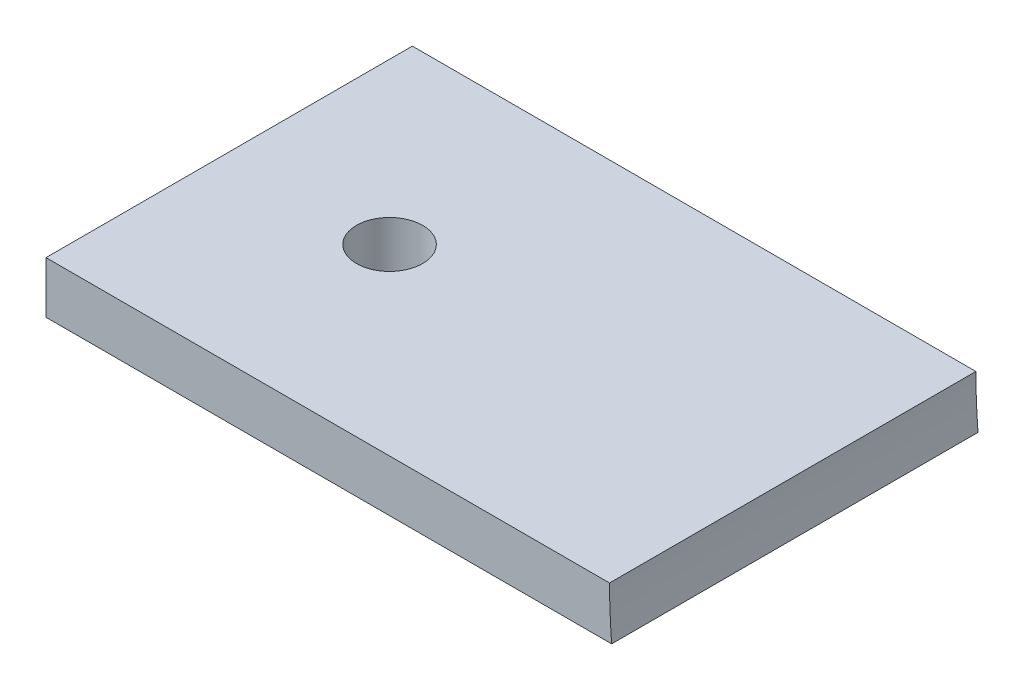
ISO-10303-21;
HEADER;
FILE_DESCRIPTION(('STEP AP214'),'2;1');
FILE_NAME('part.step','',(''),(''),'','','');
FILE_SCHEMA(('AUTOMOTIVE_DESIGN { 1 0 10303 214 1 1 1 1 }'));
ENDSEC;
DATA;
#1=APPLICATION_CONTEXT('core data for automotive mechanical design processes');
#2=APPLICATION_PROTOCOL_DEFINITION('international standard','automotive_design',2000,#1);
#3=PRODUCT_CONTEXT('',#1,'mechanical');
#4=PRODUCT('Part','Part','',(#3));
#5=PRODUCT_RELATED_PRODUCT_CATEGORY('part','',(#4));
#6=PRODUCT_DEFINITION_FORMATION('','',#4);
#7=PRODUCT_DEFINITION_CONTEXT('part definition',#1,'design');
#8=PRODUCT_DEFINITION('design','',#6,#7);
#9=PRODUCT_DEFINITION_SHAPE('','',#8);
#10=(LENGTH_UNIT() NAMED_UNIT(*) SI_UNIT(.MILLI.,.METRE.));
#11=(NAMED_UNIT(*) PLANE_ANGLE_UNIT() SI_UNIT($,.RADIAN.));
#12=(NAMED_UNIT(*) SI_UNIT($,.STERADIAN.) SOLID_ANGLE_UNIT());
#13=UNCERTAINTY_MEASURE_WITH_UNIT(LENGTH_MEASURE(1.E-05),#10,'distance_accuracy_value','');
#14=(GEOMETRIC_REPRESENTATION_CONTEXT(3) GLOBAL_UNCERTAINTY_ASSIGNED_CONTEXT((#13)) GLOBAL_UNIT_ASSIGNED_CONTEXT((#10,
#11,#12)) REPRESENTATION_CONTEXT('',''));
#15=CARTESIAN_POINT('',(0.,0.,0.));
#16=DIRECTION('',(0.,0.,1.));
#17=DIRECTION('',(1.,0.,0.));
#18=AXIS2_PLACEMENT_3D('',#15,#16,#17);
#19=CARTESIAN_POINT('',(-29.656098874284,20.5,291556.514563107));
#20=DIRECTION('',(1.,0.,0.));
#21=DIRECTION('',(0.,0.,-1.));
#22=AXIS2_PLACEMENT_3D('',#19,#20,#21);
#23=PLANE('',#22);
#24=DIRECTION('',(0.,1.,0.));
#25=VECTOR('',#24,1.);
#26=CARTESIAN_POINT('',(-29.656098874284,20.5,1.46192518337784));
#27=LINE('',#26,#25);
#28=CARTESIAN_POINT('',(-29.656098874284,20.5,1.46192518337784));
#29=VERTEX_POINT('',#28);
#30=CARTESIAN_POINT('',(-29.656098874284,21.75,1.46192518337784));
#31=VERTEX_POINT('',#30);
#32=EDGE_CURVE('E94',#29,#31,#27,.T.);
#33=ORIENTED_EDGE('',*,*,#32,.T.);
#34=DIRECTION('',(0.,0.,-1.));
#35=VECTOR('',#34,1.);
#36=CARTESIAN_POINT('',(-29.656098874284,21.75,291556.514563107));
#37=LINE('',#36,#35);
#38=CARTESIAN_POINT('',(-29.656098874284,21.75,-7.39382756529494));
#39=VERTEX_POINT('',#38);
#40=EDGE_CURVE('E88',#31,#39,#37,.T.);
#41=ORIENTED_EDGE('',*,*,#40,.T.);
#42=DIRECTION('',(0.,1.,0.));
#43=VECTOR('',#42,1.);
#44=CARTESIAN_POINT('',(-29.656098874284,20.5,-7.39382756529494));
#45=LINE('',#44,#43);
#46=CARTESIAN_POINT('',(-29.656098874284,20.5,-7.39382756529494));
#47=VERTEX_POINT('',#46);
#48=EDGE_CURVE('E93',#47,#39,#45,.T.);
#49=ORIENTED_EDGE('',*,*,#48,.F.);
#50=DIRECTION('',(0.,0.,-1.));
#51=VECTOR('',#50,1.);
#52=CARTESIAN_POINT('',(-29.656098874284,20.5,291556.514563107));
#53=LINE('',#52,#51);
#54=EDGE_CURVE('E75',#29,#47,#53,.T.);
#55=ORIENTED_EDGE('',*,*,#54,.F.);
#56=EDGE_LOOP('',(#33,#41,#49,#55));
#57=FACE_BOUND('',#56,.T.);
#58=ADVANCED_FACE('F36',(#57),#23,.F.);
#59=CARTESIAN_POINT('',(-25.7794462528812,25.5,-2.96595119095855));
#60=DIRECTION('',(0.,1.,0.));
#61=DIRECTION('',(0.,0.,1.));
#62=AXIS2_PLACEMENT_3D('',#59,#60,#61);
#63=CYLINDRICAL_SURFACE('',#62,0.799999999999999);
#64=CARTESIAN_POINT('',(-25.7794462528812,21.75,-2.96595119095855));
#65=DIRECTION('',(0.,-1.,0.));
#66=DIRECTION('',(0.,0.,-1.));
#67=AXIS2_PLACEMENT_3D('',#64,#65,#66);
#68=CIRCLE('',#67,0.799999999999999);
#69=CARTESIAN_POINT('',(-25.7794462528812,21.75,-3.76595119095855));
#70=VERTEX_POINT('',#69);
#71=EDGE_CURVE('E95',#70,#70,#68,.F.);
#72=ORIENTED_EDGE('',*,*,#71,.T.);
#73=EDGE_LOOP('',(#72));
#74=FACE_BOUND('',#73,.T.);
#75=CARTESIAN_POINT('',(-25.7794462528812,20.5,-2.96595119095855));
#76=DIRECTION('',(0.,-1.,0.));
#77=DIRECTION('',(0.,0.,-1.));
#78=AXIS2_PLACEMENT_3D('',#75,#76,#77);
#79=CIRCLE('',#78,0.799999999999999);
#80=CARTESIAN_POINT('',(-25.7794462528812,20.5,-3.76595119095855));
#81=VERTEX_POINT('',#80);
#82=EDGE_CURVE('E107',#81,#81,#79,.T.);
#83=ORIENTED_EDGE('',*,*,#82,.T.);
#84=EDGE_LOOP('',(#83));
#85=FACE_BOUND('',#84,.T.);
#86=ADVANCED_FACE('F114',(#74,#85),#63,.F.);
#87=CARTESIAN_POINT('',(-34.2277855679569,21.75,-40.4854368932039));
#88=DIRECTION('',(0.,-1.,0.));
#89=DIRECTION('',(0.,0.,-1.));
#90=AXIS2_PLACEMENT_3D('',#87,#88,#89);
#91=PLANE('',#90);
#92=ORIENTED_EDGE('',*,*,#71,.F.);
#93=EDGE_LOOP('',(#92));
#94=FACE_BOUND('',#93,.T.);
#95=ORIENTED_EDGE('',*,*,#40,.F.);
#96=DIRECTION('',(1.,0.,0.));
#97=VECTOR('',#96,1.);
#98=CARTESIAN_POINT('',(-34.2277855679569,21.75,1.46192518337784));
#99=LINE('',#98,#97);
#100=CARTESIAN_POINT('',(-16.0344245706488,21.75,1.46192518337784));
#101=VERTEX_POINT('',#100);
#102=EDGE_CURVE('E110',#31,#101,#99,.T.);
#103=ORIENTED_EDGE('',*,*,#102,.T.);
#104=DIRECTION('',(0.,0.,-1.));
#105=VECTOR('',#104,1.);
#106=CARTESIAN_POINT('',(-16.0344245706488,21.75,3.56748567590681));
#107=LINE('',#106,#105);
#108=CARTESIAN_POINT('',(-16.0344245706488,21.75,-7.39382756529494));
#109=VERTEX_POINT('',#108);
#110=EDGE_CURVE('E40',#101,#109,#107,.T.);
#111=ORIENTED_EDGE('',*,*,#110,.T.);
#112=DIRECTION('',(-1.,0.,0.));
#113=VECTOR('',#112,1.);
#114=CARTESIAN_POINT('',(-34.2277855679569,21.75,-7.39382756529494));
#115=LINE('',#114,#113);
#116=EDGE_CURVE('E70',#109,#39,#115,.T.);
#117=ORIENTED_EDGE('',*,*,#116,.T.);
#118=EDGE_LOOP('',(#95,#103,#111,#117));
#119=FACE_BOUND('',#118,.T.);
#120=ADVANCED_FACE('F86',(#94,#119),#91,.F.);
#121=CARTESIAN_POINT('',(-0.0344541676912807,21.7807750626998,3.56748567590681));
#122=DIRECTION('',(0.,0.,-1.));
#123=DIRECTION('',(-1.,0.,0.));
#124=AXIS2_PLACEMENT_3D('',#121,#122,#123);
#125=CYLINDRICAL_SURFACE('',#124,16.);
#126=CARTESIAN_POINT('',(-0.0344541676912807,21.7807750626998,1.46192518337784));
#127=DIRECTION('',(0.,0.,-1.));
#128=DIRECTION('',(-1.,0.,0.));
#129=AXIS2_PLACEMENT_3D('',#126,#127,#128);
#130=CIRCLE('',#129,16.);
#131=CARTESIAN_POINT('',(-15.9831097611501,20.5,1.46192518337784));
#132=VERTEX_POINT('',#131);
#133=EDGE_CURVE('E46',#132,#101,#130,.T.);
#134=ORIENTED_EDGE('',*,*,#133,.F.);
#135=DIRECTION('',(0.,0.,-1.));
#136=VECTOR('',#135,1.);
#137=CARTESIAN_POINT('',(-15.9831097611501,20.5,3.56748567590681));
#138=LINE('',#137,#136);
#139=CARTESIAN_POINT('',(-15.9831097611501,20.5,-7.39382756529494));
#140=VERTEX_POINT('',#139);
#141=EDGE_CURVE('E11',#140,#132,#138,.F.);
#142=ORIENTED_EDGE('',*,*,#141,.F.);
#143=CARTESIAN_POINT('',(-0.0344541676912807,21.7807750626998,-7.39382756529494));
#144=DIRECTION('',(0.,0.,1.));
#145=DIRECTION('',(1.,0.,0.));
#146=AXIS2_PLACEMENT_3D('',#143,#144,#145);
#147=CIRCLE('',#146,16.);
#148=EDGE_CURVE('E103',#109,#140,#147,.T.);
#149=ORIENTED_EDGE('',*,*,#148,.F.);
#150=ORIENTED_EDGE('',*,*,#110,.F.);
#151=EDGE_LOOP('',(#134,#142,#149,#150));
#152=FACE_BOUND('',#151,.T.);
#153=ADVANCED_FACE('F38',(#152),#125,.F.);
#154=CARTESIAN_POINT('',(-400002.038834951,20.5,-7.39382756529494));
#155=DIRECTION('',(0.,0.,-1.));
#156=DIRECTION('',(-1.,0.,0.));
#157=AXIS2_PLACEMENT_3D('',#154,#155,#156);
#158=PLANE('',#157);
#159=ORIENTED_EDGE('',*,*,#48,.T.);
#160=ORIENTED_EDGE('',*,*,#116,.F.);
#161=ORIENTED_EDGE('',*,*,#148,.T.);
#162=DIRECTION('',(-1.,0.,0.));
#163=VECTOR('',#162,1.);
#164=CARTESIAN_POINT('',(-400002.038834951,20.5,-7.39382756529494));
#165=LINE('',#164,#163);
#166=EDGE_CURVE('E63',#140,#47,#165,.T.);
#167=ORIENTED_EDGE('',*,*,#166,.T.);
#168=EDGE_LOOP('',(#159,#160,#161,#167));
#169=FACE_BOUND('',#168,.T.);
#170=ADVANCED_FACE('F97',(#169),#158,.T.);
#171=CARTESIAN_POINT('',(0.,20.5,0.));
#172=DIRECTION('',(0.,-1.,0.));
#173=DIRECTION('',(0.,0.,-1.));
#174=AXIS2_PLACEMENT_3D('',#171,#172,#173);
#175=PLANE('',#174);
#176=ORIENTED_EDGE('',*,*,#82,.F.);
#177=EDGE_LOOP('',(#176));
#178=FACE_BOUND('',#177,.T.);
#179=ORIENTED_EDGE('',*,*,#166,.F.);
#180=ORIENTED_EDGE('',*,*,#141,.T.);
#181=DIRECTION('',(-1.,0.,0.));
#182=VECTOR('',#181,1.);
#183=CARTESIAN_POINT('',(-400002.038834951,20.5,1.46192518337784));
#184=LINE('',#183,#182);
#185=EDGE_CURVE('E55',#132,#29,#184,.T.);
#186=ORIENTED_EDGE('',*,*,#185,.T.);
#187=ORIENTED_EDGE('',*,*,#54,.T.);
#188=EDGE_LOOP('',(#179,#180,#186,#187));
#189=FACE_BOUND('',#188,.T.);
#190=ADVANCED_FACE('F130',(#178,#189),#175,.T.);
#191=CARTESIAN_POINT('',(-400002.038834951,20.5,1.46192518337784));
#192=DIRECTION('',(0.,0.,-1.));
#193=DIRECTION('',(-1.,0.,0.));
#194=AXIS2_PLACEMENT_3D('',#191,#192,#193);
#195=PLANE('',#194);
#196=ORIENTED_EDGE('',*,*,#185,.F.);
#197=ORIENTED_EDGE('',*,*,#133,.T.);
#198=ORIENTED_EDGE('',*,*,#102,.F.);
#199=ORIENTED_EDGE('',*,*,#32,.F.);
#200=EDGE_LOOP('',(#196,#197,#198,#199));
#201=FACE_BOUND('',#200,.T.);
#202=ADVANCED_FACE('F131',(#201),#195,.F.);
#203=CLOSED_SHELL('',(#58,#86,#120,#153,#170,#190,#202));
#204=MANIFOLD_SOLID_BREP('B2',#203);
#205=ADVANCED_BREP_SHAPE_REPRESENTATION('',(#18,#204),#14);
#206=SHAPE_DEFINITION_REPRESENTATION(#9,#205);
ENDSEC;
END-ISO-10303-21;
